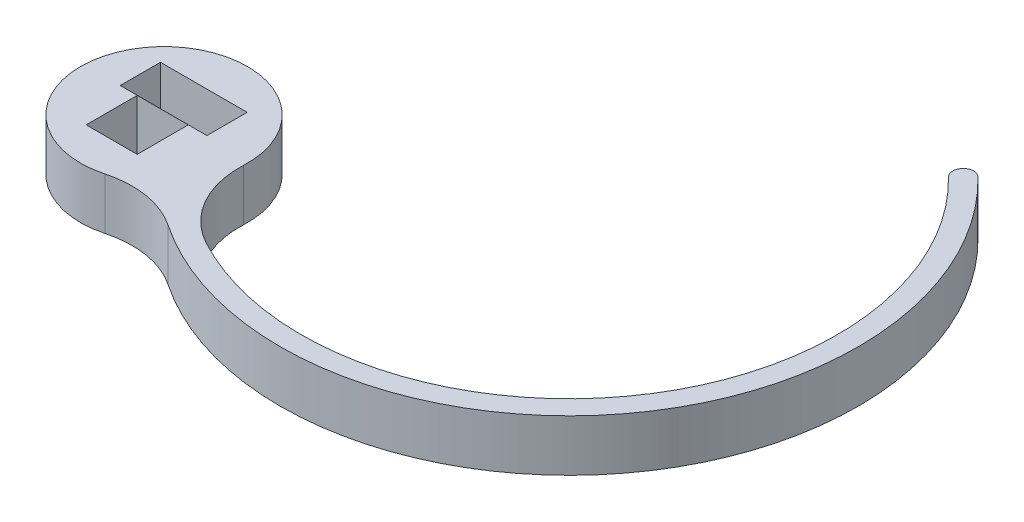
ISO-10303-21;
HEADER;
FILE_DESCRIPTION(('STEP AP214'),'2;1');
FILE_NAME('part.step','',(''),(''),'','','');
FILE_SCHEMA(('AUTOMOTIVE_DESIGN { 1 0 10303 214 1 1 1 1 }'));
ENDSEC;
DATA;
#1=APPLICATION_CONTEXT('core data for automotive mechanical design processes');
#2=APPLICATION_PROTOCOL_DEFINITION('international standard','automotive_design',2000,#1);
#3=PRODUCT_CONTEXT('',#1,'mechanical');
#4=PRODUCT('Part','Part','',(#3));
#5=PRODUCT_RELATED_PRODUCT_CATEGORY('part','',(#4));
#6=PRODUCT_DEFINITION_FORMATION('','',#4);
#7=PRODUCT_DEFINITION_CONTEXT('part definition',#1,'design');
#8=PRODUCT_DEFINITION('design','',#6,#7);
#9=PRODUCT_DEFINITION_SHAPE('','',#8);
#10=(LENGTH_UNIT() NAMED_UNIT(*) SI_UNIT(.MILLI.,.METRE.));
#11=(NAMED_UNIT(*) PLANE_ANGLE_UNIT() SI_UNIT($,.RADIAN.));
#12=(NAMED_UNIT(*) SI_UNIT($,.STERADIAN.) SOLID_ANGLE_UNIT());
#13=UNCERTAINTY_MEASURE_WITH_UNIT(LENGTH_MEASURE(1.E-05),#10,'distance_accuracy_value','');
#14=(GEOMETRIC_REPRESENTATION_CONTEXT(3) GLOBAL_UNCERTAINTY_ASSIGNED_CONTEXT((#13)) GLOBAL_UNIT_ASSIGNED_CONTEXT((#10,
#11,#12)) REPRESENTATION_CONTEXT('',''));
#15=CARTESIAN_POINT('',(0.,0.,0.));
#16=DIRECTION('',(0.,0.,1.));
#17=DIRECTION('',(1.,0.,0.));
#18=AXIS2_PLACEMENT_3D('',#15,#16,#17);
#19=CARTESIAN_POINT('',(-56.5220396,6.66,-1.051192749));
#20=DIRECTION('',(0.,-1.,0.));
#21=DIRECTION('',(0.,0.,-1.));
#22=AXIS2_PLACEMENT_3D('',#19,#20,#21);
#23=CYLINDRICAL_SURFACE('',#22,10.8);
#24=CARTESIAN_POINT('',(-56.5220396,6.66,-1.051192749));
#25=DIRECTION('',(0.,-1.,0.));
#26=DIRECTION('',(0.,0.,-1.));
#27=AXIS2_PLACEMENT_3D('',#24,#25,#26);
#28=CIRCLE('',#27,10.8);
#29=CARTESIAN_POINT('',(-45.7338623543687,6.66,-0.545988120316214));
#30=VERTEX_POINT('',#29);
#31=CARTESIAN_POINT('',(-53.7317745367242,6.66,9.38213945488684));
#32=VERTEX_POINT('',#31);
#33=EDGE_CURVE('E236',#30,#32,#28,.F.);
#34=ORIENTED_EDGE('',*,*,#33,.F.);
#35=DIRECTION('',(0.,-1.,0.));
#36=VECTOR('',#35,1.);
#37=CARTESIAN_POINT('',(-45.7338623543687,6.66,-0.545988120316214));
#38=LINE('',#37,#36);
#39=CARTESIAN_POINT('',(-45.7338623543687,0.,-0.545988120316214));
#40=VERTEX_POINT('',#39);
#41=EDGE_CURVE('E264',#30,#40,#38,.T.);
#42=ORIENTED_EDGE('',*,*,#41,.T.);
#43=CARTESIAN_POINT('',(-56.5220396,0.,-1.051192749));
#44=DIRECTION('',(0.,-1.,0.));
#45=DIRECTION('',(0.,0.,-1.));
#46=AXIS2_PLACEMENT_3D('',#43,#44,#45);
#47=CIRCLE('',#46,10.8);
#48=CARTESIAN_POINT('',(-53.7317745367242,0.,9.38213945488684));
#49=VERTEX_POINT('',#48);
#50=EDGE_CURVE('E225',#40,#49,#47,.F.);
#51=ORIENTED_EDGE('',*,*,#50,.T.);
#52=DIRECTION('',(0.,-1.,0.));
#53=VECTOR('',#52,1.);
#54=CARTESIAN_POINT('',(-53.7317745367242,6.66,9.38213945488684));
#55=LINE('',#54,#53);
#56=EDGE_CURVE('E230',#49,#32,#55,.F.);
#57=ORIENTED_EDGE('',*,*,#56,.T.);
#58=EDGE_LOOP('',(#34,#42,#51,#57));
#59=FACE_BOUND('',#58,.T.);
#60=ADVANCED_FACE('F40',(#59),#23,.T.);
#61=CARTESIAN_POINT('',(-23.059822465,6.66,-19.954796441));
#62=DIRECTION('',(0.,-1.,0.));
#63=DIRECTION('',(0.,0.,-1.));
#64=AXIS2_PLACEMENT_3D('',#61,#62,#63);
#65=CYLINDRICAL_SURFACE('',#64,37.35);
#66=CARTESIAN_POINT('',(-23.059822465,6.66,-19.954796441));
#67=DIRECTION('',(0.,-1.,0.));
#68=DIRECTION('',(0.,0.,-1.));
#69=AXIS2_PLACEMENT_3D('',#66,#67,#68);
#70=CIRCLE('',#69,37.35);
#71=CARTESIAN_POINT('',(-43.9271256008247,6.66,11.0222621643227));
#72=VERTEX_POINT('',#71);
#73=CARTESIAN_POINT('',(3.01383801007835,6.66,-46.6977717699762));
#74=VERTEX_POINT('',#73);
#75=EDGE_CURVE('E219',#72,#74,#70,.F.);
#76=ORIENTED_EDGE('',*,*,#75,.F.);
#77=DIRECTION('',(0.,-1.,0.));
#78=VECTOR('',#77,1.);
#79=CARTESIAN_POINT('',(-43.9271256008247,6.66,11.0222621643227));
#80=LINE('',#79,#78);
#81=CARTESIAN_POINT('',(-43.9271256008247,0.,11.0222621643227));
#82=VERTEX_POINT('',#81);
#83=EDGE_CURVE('E55',#72,#82,#80,.T.);
#84=ORIENTED_EDGE('',*,*,#83,.T.);
#85=CARTESIAN_POINT('',(-23.059822465,0.,-19.954796441));
#86=DIRECTION('',(0.,-1.,0.));
#87=DIRECTION('',(0.,0.,-1.));
#88=AXIS2_PLACEMENT_3D('',#85,#86,#87);
#89=CIRCLE('',#88,37.35);
#90=CARTESIAN_POINT('',(3.01383801000408,0.,-46.6977717699));
#91=VERTEX_POINT('',#90);
#92=EDGE_CURVE('E208',#82,#91,#89,.F.);
#93=ORIENTED_EDGE('',*,*,#92,.T.);
#94=DIRECTION('',(0.,-1.,0.));
#95=VECTOR('',#94,1.);
#96=CARTESIAN_POINT('',(3.01383801021227,3.33,-46.6977717698456));
#97=LINE('',#96,#95);
#98=EDGE_CURVE('E220',#91,#74,#97,.F.);
#99=ORIENTED_EDGE('',*,*,#98,.T.);
#100=EDGE_LOOP('',(#76,#84,#93,#99));
#101=FACE_BOUND('',#100,.T.);
#102=ADVANCED_FACE('F315',(#101),#65,.T.);
#103=CARTESIAN_POINT('',(-23.059822465,6.66,-19.954796441));
#104=DIRECTION('',(0.,-1.,0.));
#105=DIRECTION('',(0.,0.,-1.));
#106=AXIS2_PLACEMENT_3D('',#103,#104,#105);
#107=CYLINDRICAL_SURFACE('',#106,34.65);
#108=CARTESIAN_POINT('',(-23.059822465,0.,-19.954796441));
#109=DIRECTION('',(0.,-1.,0.));
#110=DIRECTION('',(0.,0.,-1.));
#111=AXIS2_PLACEMENT_3D('',#108,#109,#110);
#112=CIRCLE('',#111,34.65);
#113=CARTESIAN_POINT('',(1.12899508413243,0.,-44.7645446376697));
#114=VERTEX_POINT('',#113);
#115=CARTESIAN_POINT('',(-39.4090788981047,0.,10.5955605795748));
#116=VERTEX_POINT('',#115);
#117=EDGE_CURVE('E255',#114,#116,#112,.T.);
#118=ORIENTED_EDGE('',*,*,#117,.T.);
#119=DIRECTION('',(0.,-1.,0.));
#120=VECTOR('',#119,1.);
#121=CARTESIAN_POINT('',(-39.4090788981047,6.66,10.5955605795748));
#122=LINE('',#121,#120);
#123=CARTESIAN_POINT('',(-39.4090788981047,6.66,10.5955605795748));
#124=VERTEX_POINT('',#123);
#125=EDGE_CURVE('E267',#116,#124,#122,.F.);
#126=ORIENTED_EDGE('',*,*,#125,.T.);
#127=CARTESIAN_POINT('',(-23.059822465,6.66,-19.954796441));
#128=DIRECTION('',(0.,-1.,0.));
#129=DIRECTION('',(0.,0.,-1.));
#130=AXIS2_PLACEMENT_3D('',#127,#128,#129);
#131=CIRCLE('',#130,34.65);
#132=CARTESIAN_POINT('',(1.12899508413243,6.66,-44.7645446376697));
#133=VERTEX_POINT('',#132);
#134=EDGE_CURVE('E224',#133,#124,#131,.T.);
#135=ORIENTED_EDGE('',*,*,#134,.F.);
#136=DIRECTION('',(0.,1.,0.));
#137=VECTOR('',#136,1.);
#138=CARTESIAN_POINT('',(1.12899508435783,3.33,-44.7645446375985));
#139=LINE('',#138,#137);
#140=EDGE_CURVE('E215',#133,#114,#139,.F.);
#141=ORIENTED_EDGE('',*,*,#140,.T.);
#142=EDGE_LOOP('',(#118,#126,#135,#141));
#143=FACE_BOUND('',#142,.T.);
#144=ADVANCED_FACE('F288',(#143),#107,.F.);
#145=CARTESIAN_POINT('',(-67.811712903,0.,-47.468016375));
#146=DIRECTION('',(0.,1.,0.));
#147=DIRECTION('',(0.,0.,1.));
#148=AXIS2_PLACEMENT_3D('',#145,#146,#147);
#149=PLANE('',#148);
#150=DIRECTION('',(-1.,0.,0.));
#151=VECTOR('',#150,1.);
#152=CARTESIAN_POINT('',(-53.8283505024066,0.,5.10676752001133));
#153=LINE('',#152,#151);
#154=CARTESIAN_POINT('',(-53.8283505024066,0.,5.10676752001132));
#155=VERTEX_POINT('',#154);
#156=CARTESIAN_POINT('',(-60.4283505157796,0.,5.10676752001133));
#157=VERTEX_POINT('',#156);
#158=EDGE_CURVE('E173',#155,#157,#153,.T.);
#159=ORIENTED_EDGE('',*,*,#158,.F.);
#160=DIRECTION('',(0.,0.,1.));
#161=VECTOR('',#160,1.);
#162=CARTESIAN_POINT('',(-53.8283505024066,0.,-1.49323247655527));
#163=LINE('',#162,#161);
#164=CARTESIAN_POINT('',(-53.8283505024066,0.,-1.49323247655527));
#165=VERTEX_POINT('',#164);
#166=EDGE_CURVE('E146',#165,#155,#163,.T.);
#167=ORIENTED_EDGE('',*,*,#166,.F.);
#168=DIRECTION('',(1.,0.,0.));
#169=VECTOR('',#168,1.);
#170=CARTESIAN_POINT('',(-60.4283505157796,0.,-1.49323247655527));
#171=LINE('',#170,#169);
#172=CARTESIAN_POINT('',(-60.4283505157796,0.,-1.49323247655527));
#173=VERTEX_POINT('',#172);
#174=EDGE_CURVE('E164',#173,#165,#171,.T.);
#175=ORIENTED_EDGE('',*,*,#174,.F.);
#176=DIRECTION('',(0.,0.,-1.));
#177=VECTOR('',#176,1.);
#178=CARTESIAN_POINT('',(-60.4283505157796,0.,5.10676752001133));
#179=LINE('',#178,#177);
#180=EDGE_CURVE('E167',#157,#173,#179,.T.);
#181=ORIENTED_EDGE('',*,*,#180,.F.);
#182=EDGE_LOOP('',(#159,#167,#175,#181));
#183=FACE_BOUND('',#182,.T.);
#184=DIRECTION('',(-1.,0.,0.));
#185=VECTOR('',#184,1.);
#186=CARTESIAN_POINT('',(-51.4283505012979,0.,-6.70155149553285));
#187=LINE('',#186,#185);
#188=CARTESIAN_POINT('',(-51.4283505012979,0.,-6.70155149553285));
#189=VERTEX_POINT('',#188);
#190=CARTESIAN_POINT('',(-62.6283505133546,0.,-6.70155149553285));
#191=VERTEX_POINT('',#190);
#192=EDGE_CURVE('E193',#189,#191,#187,.T.);
#193=ORIENTED_EDGE('',*,*,#192,.T.);
#194=DIRECTION('',(0.,0.,1.));
#195=VECTOR('',#194,1.);
#196=CARTESIAN_POINT('',(-62.6283505133546,0.,-6.70155149553285));
#197=LINE('',#196,#195);
#198=CARTESIAN_POINT('',(-62.6283505133546,0.,-1.50155148241975));
#199=VERTEX_POINT('',#198);
#200=EDGE_CURVE('E183',#191,#199,#197,.T.);
#201=ORIENTED_EDGE('',*,*,#200,.T.);
#202=DIRECTION('',(1.,0.,0.));
#203=VECTOR('',#202,1.);
#204=CARTESIAN_POINT('',(-62.6283505133546,0.,-1.50155148241975));
#205=LINE('',#204,#203);
#206=CARTESIAN_POINT('',(-51.4283505012979,0.,-1.50155148241975));
#207=VERTEX_POINT('',#206);
#208=EDGE_CURVE('E186',#199,#207,#205,.T.);
#209=ORIENTED_EDGE('',*,*,#208,.T.);
#210=DIRECTION('',(0.,0.,-1.));
#211=VECTOR('',#210,1.);
#212=CARTESIAN_POINT('',(-51.4283505012979,0.,-1.50155148241975));
#213=LINE('',#212,#211);
#214=EDGE_CURVE('E190',#207,#189,#213,.T.);
#215=ORIENTED_EDGE('',*,*,#214,.T.);
#216=EDGE_LOOP('',(#193,#201,#209,#215));
#217=FACE_BOUND('',#216,.T.);
#218=ORIENTED_EDGE('',*,*,#50,.F.);
#219=CARTESIAN_POINT('',(-33.7469987481118,0.,0.0153503559991042));
#220=DIRECTION('',(0.,1.,0.));
#221=DIRECTION('',(0.,0.,1.));
#222=AXIS2_PLACEMENT_3D('',#219,#220,#221);
#223=CIRCLE('',#222,12.);
#224=EDGE_CURVE('E270',#40,#116,#223,.T.);
#225=ORIENTED_EDGE('',*,*,#224,.T.);
#226=ORIENTED_EDGE('',*,*,#117,.F.);
#227=CARTESIAN_POINT('',(2.071416547,0.,-45.731158204));
#228=DIRECTION('',(0.,-1.,0.));
#229=DIRECTION('',(0.,0.,-1.));
#230=AXIS2_PLACEMENT_3D('',#227,#228,#229);
#231=CIRCLE('',#230,1.34999999999999);
#232=EDGE_CURVE('E218',#114,#91,#231,.T.);
#233=ORIENTED_EDGE('',*,*,#232,.T.);
#234=ORIENTED_EDGE('',*,*,#92,.F.);
#235=CARTESIAN_POINT('',(-50.6314800219732,0.,20.9747307925389));
#236=DIRECTION('',(0.,1.,0.));
#237=DIRECTION('',(0.,0.,1.));
#238=AXIS2_PLACEMENT_3D('',#235,#236,#237);
#239=CIRCLE('',#238,12.);
#240=EDGE_CURVE('E12',#82,#49,#239,.T.);
#241=ORIENTED_EDGE('',*,*,#240,.T.);
#242=EDGE_LOOP('',(#218,#225,#226,#233,#234,#241));
#243=FACE_BOUND('',#242,.T.);
#244=ADVANCED_FACE('F285',(#183,#217,#243),#149,.F.);
#245=CARTESIAN_POINT('',(-67.811712903,6.66,-47.468016375));
#246=DIRECTION('',(0.,1.,0.));
#247=DIRECTION('',(0.,0.,1.));
#248=AXIS2_PLACEMENT_3D('',#245,#246,#247);
#249=PLANE('',#248);
#250=DIRECTION('',(0.,0.,1.));
#251=VECTOR('',#250,1.);
#252=CARTESIAN_POINT('',(-53.8283505024066,6.66,-1.49323247655527));
#253=LINE('',#252,#251);
#254=CARTESIAN_POINT('',(-53.8283505024066,6.66,-1.49323247655527));
#255=VERTEX_POINT('',#254);
#256=CARTESIAN_POINT('',(-53.8283505024066,6.66,5.10676752001133));
#257=VERTEX_POINT('',#256);
#258=EDGE_CURVE('E143',#255,#257,#253,.T.);
#259=ORIENTED_EDGE('',*,*,#258,.T.);
#260=DIRECTION('',(-1.,0.,0.));
#261=VECTOR('',#260,1.);
#262=CARTESIAN_POINT('',(-53.8283505024066,6.66,5.10676752001133));
#263=LINE('',#262,#261);
#264=CARTESIAN_POINT('',(-60.4283505157796,6.66,5.10676752001132));
#265=VERTEX_POINT('',#264);
#266=EDGE_CURVE('E155',#257,#265,#263,.T.);
#267=ORIENTED_EDGE('',*,*,#266,.T.);
#268=DIRECTION('',(0.,0.,-1.));
#269=VECTOR('',#268,1.);
#270=CARTESIAN_POINT('',(-60.4283505157796,6.66,5.10676752001133));
#271=LINE('',#270,#269);
#272=CARTESIAN_POINT('',(-60.4283505157796,6.66,-1.49323247655527));
#273=VERTEX_POINT('',#272);
#274=EDGE_CURVE('E159',#265,#273,#271,.T.);
#275=ORIENTED_EDGE('',*,*,#274,.T.);
#276=DIRECTION('',(1.,0.,0.));
#277=VECTOR('',#276,1.);
#278=CARTESIAN_POINT('',(-60.4283505157796,6.66,-1.49323247655527));
#279=LINE('',#278,#277);
#280=EDGE_CURVE('E151',#273,#255,#279,.T.);
#281=ORIENTED_EDGE('',*,*,#280,.T.);
#282=EDGE_LOOP('',(#259,#267,#275,#281));
#283=FACE_BOUND('',#282,.T.);
#284=DIRECTION('',(0.,0.,1.));
#285=VECTOR('',#284,1.);
#286=CARTESIAN_POINT('',(-62.6283505133546,6.66,-6.70155149553285));
#287=LINE('',#286,#285);
#288=CARTESIAN_POINT('',(-62.6283505133546,6.66,-6.70155149553285));
#289=VERTEX_POINT('',#288);
#290=CARTESIAN_POINT('',(-62.6283505133546,6.66,-1.50155148241975));
#291=VERTEX_POINT('',#290);
#292=EDGE_CURVE('E179',#289,#291,#287,.T.);
#293=ORIENTED_EDGE('',*,*,#292,.F.);
#294=DIRECTION('',(-1.,0.,0.));
#295=VECTOR('',#294,1.);
#296=CARTESIAN_POINT('',(-51.4283505012979,6.66,-6.70155149553285));
#297=LINE('',#296,#295);
#298=CARTESIAN_POINT('',(-51.4283505012979,6.66,-6.70155149553285));
#299=VERTEX_POINT('',#298);
#300=EDGE_CURVE('E187',#299,#289,#297,.T.);
#301=ORIENTED_EDGE('',*,*,#300,.F.);
#302=DIRECTION('',(0.,0.,-1.));
#303=VECTOR('',#302,1.);
#304=CARTESIAN_POINT('',(-51.4283505012979,6.66,-1.50155148241975));
#305=LINE('',#304,#303);
#306=CARTESIAN_POINT('',(-51.4283505012979,6.66,-1.50155148241975));
#307=VERTEX_POINT('',#306);
#308=EDGE_CURVE('E201',#307,#299,#305,.T.);
#309=ORIENTED_EDGE('',*,*,#308,.F.);
#310=DIRECTION('',(1.,0.,0.));
#311=VECTOR('',#310,1.);
#312=CARTESIAN_POINT('',(-62.6283505133546,6.66,-1.50155148241975));
#313=LINE('',#312,#311);
#314=EDGE_CURVE('E198',#291,#307,#313,.T.);
#315=ORIENTED_EDGE('',*,*,#314,.F.);
#316=EDGE_LOOP('',(#293,#301,#309,#315));
#317=FACE_BOUND('',#316,.T.);
#318=ORIENTED_EDGE('',*,*,#33,.T.);
#319=CARTESIAN_POINT('',(-50.6314800219732,6.66,20.9747307925389));
#320=DIRECTION('',(0.,1.,0.));
#321=DIRECTION('',(0.,0.,1.));
#322=AXIS2_PLACEMENT_3D('',#319,#320,#321);
#323=CIRCLE('',#322,12.);
#324=EDGE_CURVE('E48',#32,#72,#323,.F.);
#325=ORIENTED_EDGE('',*,*,#324,.T.);
#326=ORIENTED_EDGE('',*,*,#75,.T.);
#327=CARTESIAN_POINT('',(2.071416547,6.66,-45.731158204));
#328=DIRECTION('',(0.,-1.,0.));
#329=DIRECTION('',(0.,0.,-1.));
#330=AXIS2_PLACEMENT_3D('',#327,#328,#329);
#331=CIRCLE('',#330,1.34999999999999);
#332=EDGE_CURVE('E226',#74,#133,#331,.F.);
#333=ORIENTED_EDGE('',*,*,#332,.T.);
#334=ORIENTED_EDGE('',*,*,#134,.T.);
#335=CARTESIAN_POINT('',(-33.7469987481118,6.66,0.0153503559991042));
#336=DIRECTION('',(0.,1.,0.));
#337=DIRECTION('',(0.,0.,1.));
#338=AXIS2_PLACEMENT_3D('',#335,#336,#337);
#339=CIRCLE('',#338,12.);
#340=EDGE_CURVE('E272',#124,#30,#339,.F.);
#341=ORIENTED_EDGE('',*,*,#340,.T.);
#342=EDGE_LOOP('',(#318,#325,#326,#333,#334,#341));
#343=FACE_BOUND('',#342,.T.);
#344=ADVANCED_FACE('F161',(#283,#317,#343),#249,.T.);
#345=CARTESIAN_POINT('',(2.071416547,6.66,-45.731158204));
#346=DIRECTION('',(0.,-1.,0.));
#347=DIRECTION('',(0.,0.,-1.));
#348=AXIS2_PLACEMENT_3D('',#345,#346,#347);
#349=CYLINDRICAL_SURFACE('',#348,1.34999999999999);
#350=ORIENTED_EDGE('',*,*,#332,.F.);
#351=ORIENTED_EDGE('',*,*,#98,.F.);
#352=ORIENTED_EDGE('',*,*,#232,.F.);
#353=ORIENTED_EDGE('',*,*,#140,.F.);
#354=EDGE_LOOP('',(#350,#351,#352,#353));
#355=FACE_BOUND('',#354,.T.);
#356=ADVANCED_FACE('F292',(#355),#349,.T.);
#357=CARTESIAN_POINT('',(-62.6283505133546,0.,-6.70155149553285));
#358=DIRECTION('',(-1.,0.,0.));
#359=DIRECTION('',(0.,0.,1.));
#360=AXIS2_PLACEMENT_3D('',#357,#358,#359);
#361=PLANE('',#360);
#362=ORIENTED_EDGE('',*,*,#292,.T.);
#363=DIRECTION('',(0.,1.,0.));
#364=VECTOR('',#363,1.);
#365=CARTESIAN_POINT('',(-62.6283505133546,0.,-1.50155148241975));
#366=LINE('',#365,#364);
#367=EDGE_CURVE('E196',#199,#291,#366,.T.);
#368=ORIENTED_EDGE('',*,*,#367,.F.);
#369=ORIENTED_EDGE('',*,*,#200,.F.);
#370=DIRECTION('',(0.,1.,0.));
#371=VECTOR('',#370,1.);
#372=CARTESIAN_POINT('',(-62.6283505133546,0.,-6.70155149553285));
#373=LINE('',#372,#371);
#374=EDGE_CURVE('E206',#191,#289,#373,.T.);
#375=ORIENTED_EDGE('',*,*,#374,.T.);
#376=EDGE_LOOP('',(#362,#368,#369,#375));
#377=FACE_BOUND('',#376,.T.);
#378=ADVANCED_FACE('F301',(#377),#361,.F.);
#379=CARTESIAN_POINT('',(-51.4283505012979,0.,-6.70155149553285));
#380=DIRECTION('',(0.,0.,-1.));
#381=DIRECTION('',(-1.,0.,0.));
#382=AXIS2_PLACEMENT_3D('',#379,#380,#381);
#383=PLANE('',#382);
#384=ORIENTED_EDGE('',*,*,#300,.T.);
#385=ORIENTED_EDGE('',*,*,#374,.F.);
#386=ORIENTED_EDGE('',*,*,#192,.F.);
#387=DIRECTION('',(0.,1.,0.));
#388=VECTOR('',#387,1.);
#389=CARTESIAN_POINT('',(-51.4283505012979,0.,-6.70155149553285));
#390=LINE('',#389,#388);
#391=EDGE_CURVE('E209',#189,#299,#390,.T.);
#392=ORIENTED_EDGE('',*,*,#391,.T.);
#393=EDGE_LOOP('',(#384,#385,#386,#392));
#394=FACE_BOUND('',#393,.T.);
#395=ADVANCED_FACE('F307',(#394),#383,.F.);
#396=CARTESIAN_POINT('',(-51.4283505012979,0.,-1.50155148241975));
#397=DIRECTION('',(1.,0.,0.));
#398=DIRECTION('',(0.,0.,-1.));
#399=AXIS2_PLACEMENT_3D('',#396,#397,#398);
#400=PLANE('',#399);
#401=ORIENTED_EDGE('',*,*,#308,.T.);
#402=ORIENTED_EDGE('',*,*,#391,.F.);
#403=ORIENTED_EDGE('',*,*,#214,.F.);
#404=DIRECTION('',(0.,1.,0.));
#405=VECTOR('',#404,1.);
#406=CARTESIAN_POINT('',(-51.4283505012979,0.,-1.50155148241975));
#407=LINE('',#406,#405);
#408=EDGE_CURVE('E211',#207,#307,#407,.T.);
#409=ORIENTED_EDGE('',*,*,#408,.T.);
#410=EDGE_LOOP('',(#401,#402,#403,#409));
#411=FACE_BOUND('',#410,.T.);
#412=ADVANCED_FACE('F338',(#411),#400,.F.);
#413=CARTESIAN_POINT('',(-62.6283505133546,0.,-1.50155148241975));
#414=DIRECTION('',(0.,0.,1.));
#415=DIRECTION('',(1.,0.,0.));
#416=AXIS2_PLACEMENT_3D('',#413,#414,#415);
#417=PLANE('',#416);
#418=ORIENTED_EDGE('',*,*,#314,.T.);
#419=ORIENTED_EDGE('',*,*,#408,.F.);
#420=ORIENTED_EDGE('',*,*,#208,.F.);
#421=ORIENTED_EDGE('',*,*,#367,.T.);
#422=EDGE_LOOP('',(#418,#419,#420,#421));
#423=FACE_BOUND('',#422,.T.);
#424=ADVANCED_FACE('F335',(#423),#417,.F.);
#425=CARTESIAN_POINT('',(-53.8283505024066,6.66,-1.49323247655527));
#426=DIRECTION('',(1.,0.,0.));
#427=DIRECTION('',(0.,0.,-1.));
#428=AXIS2_PLACEMENT_3D('',#425,#426,#427);
#429=PLANE('',#428);
#430=ORIENTED_EDGE('',*,*,#166,.T.);
#431=DIRECTION('',(0.,-1.,0.));
#432=VECTOR('',#431,1.);
#433=CARTESIAN_POINT('',(-53.8283505024066,6.66,5.10676752001133));
#434=LINE('',#433,#432);
#435=EDGE_CURVE('E139',#257,#155,#434,.T.);
#436=ORIENTED_EDGE('',*,*,#435,.F.);
#437=ORIENTED_EDGE('',*,*,#258,.F.);
#438=DIRECTION('',(0.,-1.,0.));
#439=VECTOR('',#438,1.);
#440=CARTESIAN_POINT('',(-53.8283505024066,6.66,-1.49323247655527));
#441=LINE('',#440,#439);
#442=EDGE_CURVE('E177',#255,#165,#441,.T.);
#443=ORIENTED_EDGE('',*,*,#442,.T.);
#444=EDGE_LOOP('',(#430,#436,#437,#443));
#445=FACE_BOUND('',#444,.T.);
#446=ADVANCED_FACE('F141',(#445),#429,.F.);
#447=CARTESIAN_POINT('',(-60.4283505157796,6.66,-1.49323247655527));
#448=DIRECTION('',(0.,0.,-1.));
#449=DIRECTION('',(-1.,0.,0.));
#450=AXIS2_PLACEMENT_3D('',#447,#448,#449);
#451=PLANE('',#450);
#452=ORIENTED_EDGE('',*,*,#174,.T.);
#453=ORIENTED_EDGE('',*,*,#442,.F.);
#454=ORIENTED_EDGE('',*,*,#280,.F.);
#455=DIRECTION('',(0.,-1.,0.));
#456=VECTOR('',#455,1.);
#457=CARTESIAN_POINT('',(-60.4283505157796,6.66,-1.49323247655527));
#458=LINE('',#457,#456);
#459=EDGE_CURVE('E180',#273,#173,#458,.T.);
#460=ORIENTED_EDGE('',*,*,#459,.T.);
#461=EDGE_LOOP('',(#452,#453,#454,#460));
#462=FACE_BOUND('',#461,.T.);
#463=ADVANCED_FACE('F349',(#462),#451,.F.);
#464=CARTESIAN_POINT('',(-60.4283505157796,6.66,5.10676752001133));
#465=DIRECTION('',(-1.,0.,0.));
#466=DIRECTION('',(0.,0.,1.));
#467=AXIS2_PLACEMENT_3D('',#464,#465,#466);
#468=PLANE('',#467);
#469=ORIENTED_EDGE('',*,*,#180,.T.);
#470=ORIENTED_EDGE('',*,*,#459,.F.);
#471=ORIENTED_EDGE('',*,*,#274,.F.);
#472=DIRECTION('',(0.,-1.,0.));
#473=VECTOR('',#472,1.);
#474=CARTESIAN_POINT('',(-60.4283505157796,6.66,5.10676752001133));
#475=LINE('',#474,#473);
#476=EDGE_CURVE('E150',#265,#157,#475,.T.);
#477=ORIENTED_EDGE('',*,*,#476,.T.);
#478=EDGE_LOOP('',(#469,#470,#471,#477));
#479=FACE_BOUND('',#478,.T.);
#480=ADVANCED_FACE('F352',(#479),#468,.F.);
#481=CARTESIAN_POINT('',(-53.8283505024066,6.66,5.10676752001133));
#482=DIRECTION('',(0.,0.,1.));
#483=DIRECTION('',(1.,0.,0.));
#484=AXIS2_PLACEMENT_3D('',#481,#482,#483);
#485=PLANE('',#484);
#486=ORIENTED_EDGE('',*,*,#158,.T.);
#487=ORIENTED_EDGE('',*,*,#476,.F.);
#488=ORIENTED_EDGE('',*,*,#266,.F.);
#489=ORIENTED_EDGE('',*,*,#435,.T.);
#490=EDGE_LOOP('',(#486,#487,#488,#489));
#491=FACE_BOUND('',#490,.T.);
#492=ADVANCED_FACE('F156',(#491),#485,.F.);
#493=CARTESIAN_POINT('',(-33.7469987481118,6.66,0.0153503559991042));
#494=DIRECTION('',(0.,-1.,0.));
#495=DIRECTION('',(0.,0.,-1.));
#496=AXIS2_PLACEMENT_3D('',#493,#494,#495);
#497=CYLINDRICAL_SURFACE('',#496,12.);
#498=ORIENTED_EDGE('',*,*,#340,.F.);
#499=ORIENTED_EDGE('',*,*,#125,.F.);
#500=ORIENTED_EDGE('',*,*,#224,.F.);
#501=ORIENTED_EDGE('',*,*,#41,.F.);
#502=EDGE_LOOP('',(#498,#499,#500,#501));
#503=FACE_BOUND('',#502,.T.);
#504=ADVANCED_FACE('F282',(#503),#497,.F.);
#505=CARTESIAN_POINT('',(-50.6314800219732,6.66,20.9747307925389));
#506=DIRECTION('',(0.,-1.,0.));
#507=DIRECTION('',(0.,0.,-1.));
#508=AXIS2_PLACEMENT_3D('',#505,#506,#507);
#509=CYLINDRICAL_SURFACE('',#508,12.);
#510=ORIENTED_EDGE('',*,*,#240,.F.);
#511=ORIENTED_EDGE('',*,*,#83,.F.);
#512=ORIENTED_EDGE('',*,*,#324,.F.);
#513=ORIENTED_EDGE('',*,*,#56,.F.);
#514=EDGE_LOOP('',(#510,#511,#512,#513));
#515=FACE_BOUND('',#514,.T.);
#516=ADVANCED_FACE('F42',(#515),#509,.F.);
#517=CLOSED_SHELL('',(#60,#102,#144,#244,#344,#356,#378,#395,#412,#424,#446,#463,#480,#492,#504,#516));
#518=MANIFOLD_SOLID_BREP('B2',#517);
#519=ADVANCED_BREP_SHAPE_REPRESENTATION('',(#18,#518),#14);
#520=SHAPE_DEFINITION_REPRESENTATION(#9,#519);
ENDSEC;
END-ISO-10303-21;
